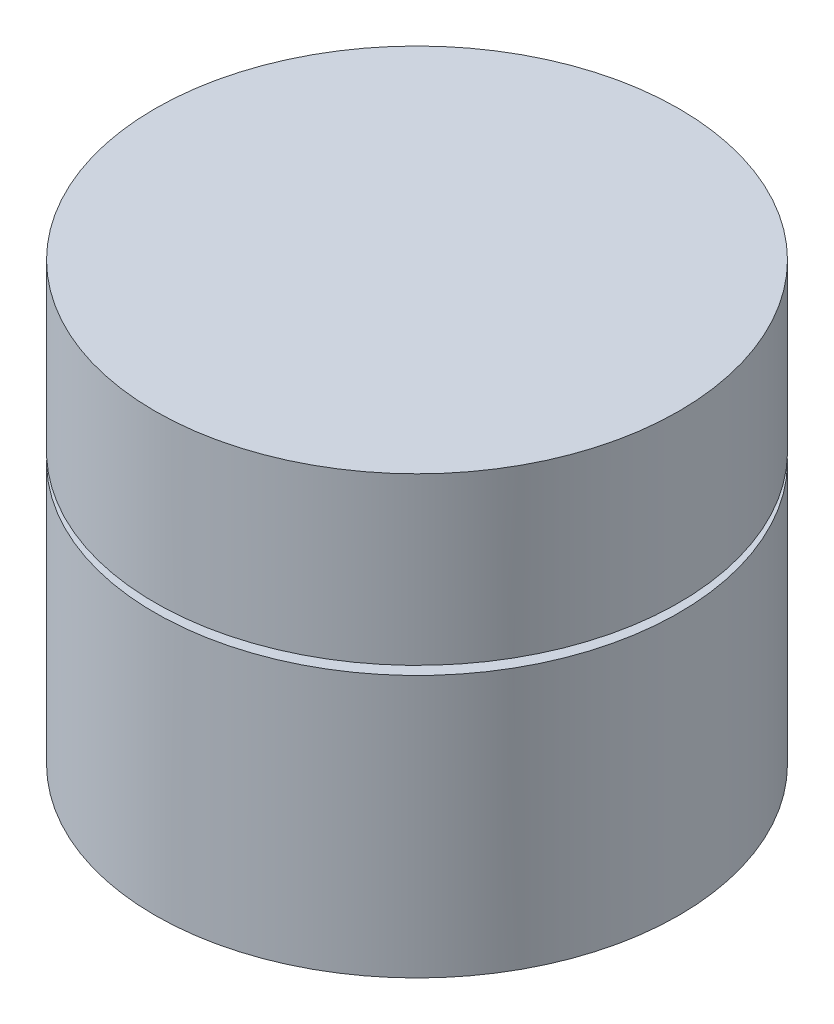
ISO-10303-21;
HEADER;
FILE_DESCRIPTION(('STEP AP214'),'2;1');
FILE_NAME('part.step','',(''),(''),'','','');
FILE_SCHEMA(('AUTOMOTIVE_DESIGN { 1 0 10303 214 1 1 1 1 }'));
ENDSEC;
DATA;
#1=APPLICATION_CONTEXT('core data for automotive mechanical design processes');
#2=APPLICATION_PROTOCOL_DEFINITION('international standard','automotive_design',2000,#1);
#3=PRODUCT_CONTEXT('',#1,'mechanical');
#4=PRODUCT('Part','Part','',(#3));
#5=PRODUCT_RELATED_PRODUCT_CATEGORY('part','',(#4));
#6=PRODUCT_DEFINITION_FORMATION('','',#4);
#7=PRODUCT_DEFINITION_CONTEXT('part definition',#1,'design');
#8=PRODUCT_DEFINITION('design','',#6,#7);
#9=PRODUCT_DEFINITION_SHAPE('','',#8);
#10=(LENGTH_UNIT() NAMED_UNIT(*) SI_UNIT(.MILLI.,.METRE.));
#11=(NAMED_UNIT(*) PLANE_ANGLE_UNIT() SI_UNIT($,.RADIAN.));
#12=(NAMED_UNIT(*) SI_UNIT($,.STERADIAN.) SOLID_ANGLE_UNIT());
#13=UNCERTAINTY_MEASURE_WITH_UNIT(LENGTH_MEASURE(1.E-05),#10,'distance_accuracy_value','');
#14=(GEOMETRIC_REPRESENTATION_CONTEXT(3) GLOBAL_UNCERTAINTY_ASSIGNED_CONTEXT((#13)) GLOBAL_UNIT_ASSIGNED_CONTEXT((#10,
#11,#12)) REPRESENTATION_CONTEXT('',''));
#15=CARTESIAN_POINT('',(0.,0.,0.));
#16=DIRECTION('',(0.,0.,1.));
#17=DIRECTION('',(1.,0.,0.));
#18=AXIS2_PLACEMENT_3D('',#15,#16,#17);
#19=CARTESIAN_POINT('',(0.,5.,0.));
#20=DIRECTION('',(0.,-1.,0.));
#21=DIRECTION('',(0.,0.,-1.));
#22=AXIS2_PLACEMENT_3D('',#19,#20,#21);
#23=CYLINDRICAL_SURFACE('',#22,3.);
#24=CARTESIAN_POINT('',(0.,3.,0.));
#25=DIRECTION('',(0.,-1.,0.));
#26=DIRECTION('',(0.,0.,-1.));
#27=AXIS2_PLACEMENT_3D('',#24,#25,#26);
#28=CIRCLE('',#27,3.);
#29=CARTESIAN_POINT('',(0.,3.,-3.));
#30=VERTEX_POINT('',#29);
#31=EDGE_CURVE('E42',#30,#30,#28,.T.);
#32=ORIENTED_EDGE('',*,*,#31,.T.);
#33=EDGE_LOOP('',(#32));
#34=FACE_BOUND('',#33,.T.);
#35=CARTESIAN_POINT('',(0.,0.,0.));
#36=DIRECTION('',(0.,1.,0.));
#37=DIRECTION('',(0.,0.,1.));
#38=AXIS2_PLACEMENT_3D('',#35,#36,#37);
#39=CIRCLE('',#38,3.);
#40=CARTESIAN_POINT('',(0.,0.,3.));
#41=VERTEX_POINT('',#40);
#42=EDGE_CURVE('E35',#41,#41,#39,.T.);
#43=ORIENTED_EDGE('',*,*,#42,.T.);
#44=EDGE_LOOP('',(#43));
#45=FACE_BOUND('',#44,.T.);
#46=ADVANCED_FACE('F31',(#34,#45),#23,.T.);
#47=CARTESIAN_POINT('',(0.,0.,0.));
#48=DIRECTION('',(0.,1.,0.));
#49=DIRECTION('',(0.,0.,1.));
#50=AXIS2_PLACEMENT_3D('',#47,#48,#49);
#51=PLANE('',#50);
#52=ORIENTED_EDGE('',*,*,#42,.F.);
#53=EDGE_LOOP('',(#52));
#54=FACE_BOUND('',#53,.T.);
#55=ADVANCED_FACE('F67',(#54),#51,.F.);
#56=CARTESIAN_POINT('',(3.,3.,0.));
#57=DIRECTION('',(0.,-1.,0.));
#58=DIRECTION('',(0.,0.,-1.));
#59=AXIS2_PLACEMENT_3D('',#56,#57,#58);
#60=PLANE('',#59);
#61=ORIENTED_EDGE('',*,*,#31,.F.);
#62=EDGE_LOOP('',(#61));
#63=FACE_BOUND('',#62,.T.);
#64=CARTESIAN_POINT('',(0.,3.,0.));
#65=DIRECTION('',(0.,-1.,0.));
#66=DIRECTION('',(0.,0.,-1.));
#67=AXIS2_PLACEMENT_3D('',#64,#65,#66);
#68=CIRCLE('',#67,2.75);
#69=CARTESIAN_POINT('',(0.,3.,-2.75));
#70=VERTEX_POINT('',#69);
#71=EDGE_CURVE('E46',#70,#70,#68,.T.);
#72=ORIENTED_EDGE('',*,*,#71,.T.);
#73=EDGE_LOOP('',(#72));
#74=FACE_BOUND('',#73,.T.);
#75=ADVANCED_FACE('F74',(#63,#74),#60,.F.);
#76=CARTESIAN_POINT('',(0.,0.,0.));
#77=DIRECTION('',(0.,-1.,0.));
#78=DIRECTION('',(0.,0.,-1.));
#79=AXIS2_PLACEMENT_3D('',#76,#77,#78);
#80=CYLINDRICAL_SURFACE('',#79,2.75);
#81=ORIENTED_EDGE('',*,*,#71,.F.);
#82=EDGE_LOOP('',(#81));
#83=FACE_BOUND('',#82,.T.);
#84=CARTESIAN_POINT('',(0.,3.1,0.));
#85=DIRECTION('',(0.,-1.,0.));
#86=DIRECTION('',(0.,0.,-1.));
#87=AXIS2_PLACEMENT_3D('',#84,#85,#86);
#88=CIRCLE('',#87,2.75);
#89=CARTESIAN_POINT('',(0.,3.1,-2.75));
#90=VERTEX_POINT('',#89);
#91=EDGE_CURVE('E49',#90,#90,#88,.T.);
#92=ORIENTED_EDGE('',*,*,#91,.T.);
#93=EDGE_LOOP('',(#92));
#94=FACE_BOUND('',#93,.T.);
#95=ADVANCED_FACE('F82',(#83,#94),#80,.T.);
#96=CARTESIAN_POINT('',(3.,3.1,0.));
#97=DIRECTION('',(0.,1.,0.));
#98=DIRECTION('',(0.,0.,1.));
#99=AXIS2_PLACEMENT_3D('',#96,#97,#98);
#100=PLANE('',#99);
#101=ORIENTED_EDGE('',*,*,#91,.F.);
#102=EDGE_LOOP('',(#101));
#103=FACE_BOUND('',#102,.T.);
#104=CARTESIAN_POINT('',(0.,3.1,0.));
#105=DIRECTION('',(0.,-1.,0.));
#106=DIRECTION('',(0.,0.,-1.));
#107=AXIS2_PLACEMENT_3D('',#104,#105,#106);
#108=CIRCLE('',#107,3.);
#109=CARTESIAN_POINT('',(0.,3.1,-3.));
#110=VERTEX_POINT('',#109);
#111=EDGE_CURVE('E52',#110,#110,#108,.T.);
#112=ORIENTED_EDGE('',*,*,#111,.T.);
#113=EDGE_LOOP('',(#112));
#114=FACE_BOUND('',#113,.T.);
#115=ADVANCED_FACE('F56',(#103,#114),#100,.F.);
#116=CARTESIAN_POINT('',(0.,5.,0.));
#117=DIRECTION('',(0.,1.,0.));
#118=DIRECTION('',(0.,0.,1.));
#119=AXIS2_PLACEMENT_3D('',#116,#117,#118);
#120=PLANE('',#119);
#121=CARTESIAN_POINT('',(0.,5.,0.));
#122=DIRECTION('',(0.,1.,0.));
#123=DIRECTION('',(0.,0.,1.));
#124=AXIS2_PLACEMENT_3D('',#121,#122,#123);
#125=CIRCLE('',#124,3.);
#126=CARTESIAN_POINT('',(0.,5.,3.));
#127=VERTEX_POINT('',#126);
#128=EDGE_CURVE('E10',#127,#127,#125,.T.);
#129=ORIENTED_EDGE('',*,*,#128,.T.);
#130=EDGE_LOOP('',(#129));
#131=FACE_BOUND('',#130,.T.);
#132=ADVANCED_FACE('F60',(#131),#120,.T.);
#133=ORIENTED_EDGE('',*,*,#111,.F.);
#134=EDGE_LOOP('',(#133));
#135=FACE_BOUND('',#134,.T.);
#136=ORIENTED_EDGE('',*,*,#128,.F.);
#137=EDGE_LOOP('',(#136));
#138=FACE_BOUND('',#137,.T.);
#139=ADVANCED_FACE('F33',(#135,#138),#23,.T.);
#140=CLOSED_SHELL('',(#46,#55,#75,#95,#115,#132,#139));
#141=MANIFOLD_SOLID_BREP('B2',#140);
#142=ADVANCED_BREP_SHAPE_REPRESENTATION('',(#18,#141),#14);
#143=SHAPE_DEFINITION_REPRESENTATION(#9,#142);
ENDSEC;
END-ISO-10303-21;
